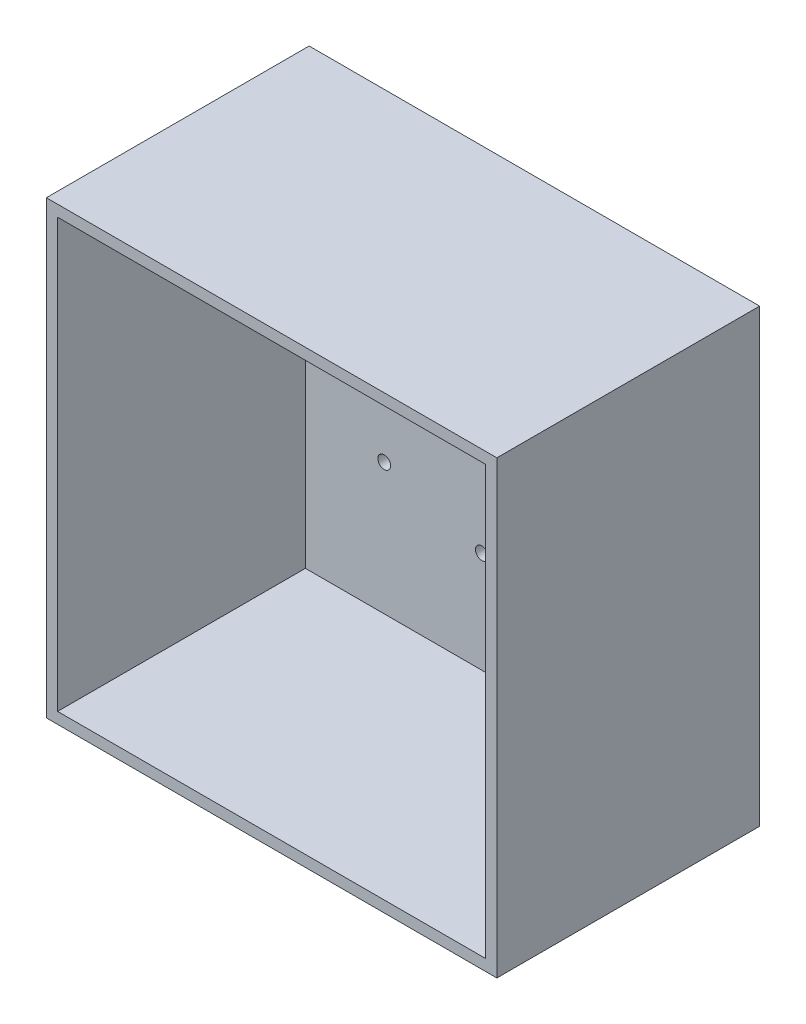
ISO-10303-21;
HEADER;
FILE_DESCRIPTION(('STEP AP214'),'2;1');
FILE_NAME('part.step','',(''),(''),'','','');
FILE_SCHEMA(('AUTOMOTIVE_DESIGN { 1 0 10303 214 1 1 1 1 }'));
ENDSEC;
DATA;
#1=APPLICATION_CONTEXT('core data for automotive mechanical design processes');
#2=APPLICATION_PROTOCOL_DEFINITION('international standard','automotive_design',2000,#1);
#3=PRODUCT_CONTEXT('',#1,'mechanical');
#4=PRODUCT('Part','Part','',(#3));
#5=PRODUCT_RELATED_PRODUCT_CATEGORY('part','',(#4));
#6=PRODUCT_DEFINITION_FORMATION('','',#4);
#7=PRODUCT_DEFINITION_CONTEXT('part definition',#1,'design');
#8=PRODUCT_DEFINITION('design','',#6,#7);
#9=PRODUCT_DEFINITION_SHAPE('','',#8);
#10=(LENGTH_UNIT() NAMED_UNIT(*) SI_UNIT(.MILLI.,.METRE.));
#11=(NAMED_UNIT(*) PLANE_ANGLE_UNIT() SI_UNIT($,.RADIAN.));
#12=(NAMED_UNIT(*) SI_UNIT($,.STERADIAN.) SOLID_ANGLE_UNIT());
#13=UNCERTAINTY_MEASURE_WITH_UNIT(LENGTH_MEASURE(1.E-05),#10,'distance_accuracy_value','');
#14=(GEOMETRIC_REPRESENTATION_CONTEXT(3) GLOBAL_UNCERTAINTY_ASSIGNED_CONTEXT((#13)) GLOBAL_UNIT_ASSIGNED_CONTEXT((#10,
#11,#12)) REPRESENTATION_CONTEXT('',''));
#15=CARTESIAN_POINT('',(0.,0.,0.));
#16=DIRECTION('',(0.,0.,1.));
#17=DIRECTION('',(1.,0.,0.));
#18=AXIS2_PLACEMENT_3D('',#15,#16,#17);
#19=CARTESIAN_POINT('',(-127.,-57.,185.5));
#20=DIRECTION('',(0.,0.,1.));
#21=DIRECTION('',(1.,0.,0.));
#22=AXIS2_PLACEMENT_3D('',#19,#20,#21);
#23=PLANE('',#22);
#24=CARTESIAN_POINT('',(-80.,30.,185.5));
#25=DIRECTION('',(0.,0.,1.));
#26=DIRECTION('',(1.,0.,0.));
#27=AXIS2_PLACEMENT_3D('',#24,#25,#26);
#28=CIRCLE('',#27,1.7);
#29=CARTESIAN_POINT('',(-78.3,30.,185.5));
#30=VERTEX_POINT('',#29);
#31=EDGE_CURVE('E9',#30,#30,#28,.T.);
#32=ORIENTED_EDGE('',*,*,#31,.F.);
#33=EDGE_LOOP('',(#32));
#34=FACE_BOUND('',#33,.T.);
#35=CARTESIAN_POINT('',(-106.,22.,185.5));
#36=DIRECTION('',(0.,0.,1.));
#37=DIRECTION('',(1.,0.,0.));
#38=AXIS2_PLACEMENT_3D('',#35,#36,#37);
#39=CIRCLE('',#38,1.7);
#40=CARTESIAN_POINT('',(-104.3,22.,185.5));
#41=VERTEX_POINT('',#40);
#42=EDGE_CURVE('E209',#41,#41,#39,.T.);
#43=ORIENTED_EDGE('',*,*,#42,.F.);
#44=EDGE_LOOP('',(#43));
#45=FACE_BOUND('',#44,.T.);
#46=CARTESIAN_POINT('',(-80.,-30.,185.5));
#47=DIRECTION('',(0.,0.,1.));
#48=DIRECTION('',(1.,0.,0.));
#49=AXIS2_PLACEMENT_3D('',#46,#47,#48);
#50=CIRCLE('',#49,1.7);
#51=CARTESIAN_POINT('',(-78.3,-30.,185.5));
#52=VERTEX_POINT('',#51);
#53=EDGE_CURVE('E223',#52,#52,#50,.T.);
#54=ORIENTED_EDGE('',*,*,#53,.F.);
#55=EDGE_LOOP('',(#54));
#56=FACE_BOUND('',#55,.T.);
#57=CARTESIAN_POINT('',(-106.,-22.,185.5));
#58=DIRECTION('',(0.,0.,1.));
#59=DIRECTION('',(1.,0.,0.));
#60=AXIS2_PLACEMENT_3D('',#57,#58,#59);
#61=CIRCLE('',#60,1.7);
#62=CARTESIAN_POINT('',(-104.3,-22.,185.5));
#63=VERTEX_POINT('',#62);
#64=EDGE_CURVE('E195',#63,#63,#61,.T.);
#65=ORIENTED_EDGE('',*,*,#64,.F.);
#66=EDGE_LOOP('',(#65));
#67=FACE_BOUND('',#66,.T.);
#68=DIRECTION('',(0.,1.,0.));
#69=VECTOR('',#68,1.);
#70=CARTESIAN_POINT('',(-127.,-57.,185.5));
#71=LINE('',#70,#69);
#72=CARTESIAN_POINT('',(-127.,-57.,185.5));
#73=VERTEX_POINT('',#72);
#74=CARTESIAN_POINT('',(-127.,57.,185.5));
#75=VERTEX_POINT('',#74);
#76=EDGE_CURVE('E181',#73,#75,#71,.T.);
#77=ORIENTED_EDGE('',*,*,#76,.F.);
#78=DIRECTION('',(1.,0.,0.));
#79=VECTOR('',#78,1.);
#80=CARTESIAN_POINT('',(-127.,-57.,185.5));
#81=LINE('',#80,#79);
#82=CARTESIAN_POINT('',(-13.,-57.,185.5));
#83=VERTEX_POINT('',#82);
#84=EDGE_CURVE('E136',#73,#83,#81,.T.);
#85=ORIENTED_EDGE('',*,*,#84,.T.);
#86=DIRECTION('',(0.,1.,0.));
#87=VECTOR('',#86,1.);
#88=CARTESIAN_POINT('',(-13.,-57.,185.5));
#89=LINE('',#88,#87);
#90=CARTESIAN_POINT('',(-13.,57.,185.5));
#91=VERTEX_POINT('',#90);
#92=EDGE_CURVE('E251',#83,#91,#89,.T.);
#93=ORIENTED_EDGE('',*,*,#92,.T.);
#94=DIRECTION('',(1.,0.,0.));
#95=VECTOR('',#94,1.);
#96=CARTESIAN_POINT('',(-127.,57.,185.5));
#97=LINE('',#96,#95);
#98=EDGE_CURVE('E178',#75,#91,#97,.T.);
#99=ORIENTED_EDGE('',*,*,#98,.F.);
#100=EDGE_LOOP('',(#77,#85,#93,#99));
#101=FACE_BOUND('',#100,.T.);
#102=ADVANCED_FACE('F14',(#34,#45,#56,#67,#101),#23,.T.);
#103=CARTESIAN_POINT('',(-80.,30.,181.49));
#104=DIRECTION('',(0.,0.,1.));
#105=DIRECTION('',(1.,0.,0.));
#106=AXIS2_PLACEMENT_3D('',#103,#104,#105);
#107=CYLINDRICAL_SURFACE('',#106,1.7);
#108=DIRECTION('',(0.,0.,1.));
#109=VECTOR('',#108,1.);
#110=CARTESIAN_POINT('',(-78.3,30.,181.49));
#111=LINE('',#110,#109);
#112=CARTESIAN_POINT('',(-78.3,30.,181.5));
#113=VERTEX_POINT('',#112);
#114=EDGE_CURVE('E25',#113,#30,#111,.T.);
#115=ORIENTED_EDGE('',*,*,#114,.F.);
#116=CARTESIAN_POINT('',(-80.,30.,181.5));
#117=DIRECTION('',(0.,0.,1.));
#118=DIRECTION('',(1.,0.,0.));
#119=AXIS2_PLACEMENT_3D('',#116,#117,#118);
#120=CIRCLE('',#119,1.7);
#121=EDGE_CURVE('E202',#113,#113,#120,.T.);
#122=ORIENTED_EDGE('',*,*,#121,.F.);
#123=ORIENTED_EDGE('',*,*,#114,.T.);
#124=ORIENTED_EDGE('',*,*,#31,.T.);
#125=EDGE_LOOP('',(#115,#122,#123,#124));
#126=FACE_BOUND('',#125,.T.);
#127=ADVANCED_FACE('F16',(#126),#107,.F.);
#128=CARTESIAN_POINT('',(-106.,22.,181.49));
#129=DIRECTION('',(0.,0.,1.));
#130=DIRECTION('',(1.,0.,0.));
#131=AXIS2_PLACEMENT_3D('',#128,#129,#130);
#132=CYLINDRICAL_SURFACE('',#131,1.7);
#133=DIRECTION('',(0.,0.,1.));
#134=VECTOR('',#133,1.);
#135=CARTESIAN_POINT('',(-104.3,22.,181.49));
#136=LINE('',#135,#134);
#137=CARTESIAN_POINT('',(-104.3,22.,181.5));
#138=VERTEX_POINT('',#137);
#139=EDGE_CURVE('E212',#138,#41,#136,.T.);
#140=ORIENTED_EDGE('',*,*,#139,.F.);
#141=CARTESIAN_POINT('',(-106.,22.,181.5));
#142=DIRECTION('',(0.,0.,1.));
#143=DIRECTION('',(1.,0.,0.));
#144=AXIS2_PLACEMENT_3D('',#141,#142,#143);
#145=CIRCLE('',#144,1.7);
#146=EDGE_CURVE('E206',#138,#138,#145,.T.);
#147=ORIENTED_EDGE('',*,*,#146,.F.);
#148=ORIENTED_EDGE('',*,*,#139,.T.);
#149=ORIENTED_EDGE('',*,*,#42,.T.);
#150=EDGE_LOOP('',(#140,#147,#148,#149));
#151=FACE_BOUND('',#150,.T.);
#152=ADVANCED_FACE('F278',(#151),#132,.F.);
#153=CARTESIAN_POINT('',(-80.,-30.,181.49));
#154=DIRECTION('',(0.,0.,1.));
#155=DIRECTION('',(1.,0.,0.));
#156=AXIS2_PLACEMENT_3D('',#153,#154,#155);
#157=CYLINDRICAL_SURFACE('',#156,1.7);
#158=DIRECTION('',(0.,0.,1.));
#159=VECTOR('',#158,1.);
#160=CARTESIAN_POINT('',(-78.3,-30.,181.49));
#161=LINE('',#160,#159);
#162=CARTESIAN_POINT('',(-78.3,-30.,181.5));
#163=VERTEX_POINT('',#162);
#164=EDGE_CURVE('E198',#163,#52,#161,.T.);
#165=ORIENTED_EDGE('',*,*,#164,.F.);
#166=CARTESIAN_POINT('',(-80.,-30.,181.5));
#167=DIRECTION('',(0.,0.,1.));
#168=DIRECTION('',(1.,0.,0.));
#169=AXIS2_PLACEMENT_3D('',#166,#167,#168);
#170=CIRCLE('',#169,1.7);
#171=EDGE_CURVE('E18',#163,#163,#170,.T.);
#172=ORIENTED_EDGE('',*,*,#171,.F.);
#173=ORIENTED_EDGE('',*,*,#164,.T.);
#174=ORIENTED_EDGE('',*,*,#53,.T.);
#175=EDGE_LOOP('',(#165,#172,#173,#174));
#176=FACE_BOUND('',#175,.T.);
#177=ADVANCED_FACE('F275',(#176),#157,.F.);
#178=CARTESIAN_POINT('',(-106.,-22.,181.49));
#179=DIRECTION('',(0.,0.,1.));
#180=DIRECTION('',(1.,0.,0.));
#181=AXIS2_PLACEMENT_3D('',#178,#179,#180);
#182=CYLINDRICAL_SURFACE('',#181,1.7);
#183=DIRECTION('',(0.,0.,1.));
#184=VECTOR('',#183,1.);
#185=CARTESIAN_POINT('',(-104.3,-22.,181.49));
#186=LINE('',#185,#184);
#187=CARTESIAN_POINT('',(-104.3,-22.,181.5));
#188=VERTEX_POINT('',#187);
#189=EDGE_CURVE('E191',#188,#63,#186,.T.);
#190=ORIENTED_EDGE('',*,*,#189,.F.);
#191=CARTESIAN_POINT('',(-106.,-22.,181.5));
#192=DIRECTION('',(0.,0.,1.));
#193=DIRECTION('',(1.,0.,0.));
#194=AXIS2_PLACEMENT_3D('',#191,#192,#193);
#195=CIRCLE('',#194,1.7);
#196=EDGE_CURVE('E173',#188,#188,#195,.T.);
#197=ORIENTED_EDGE('',*,*,#196,.F.);
#198=ORIENTED_EDGE('',*,*,#189,.T.);
#199=ORIENTED_EDGE('',*,*,#64,.T.);
#200=EDGE_LOOP('',(#190,#197,#198,#199));
#201=FACE_BOUND('',#200,.T.);
#202=ADVANCED_FACE('F277',(#201),#182,.F.);
#203=CARTESIAN_POINT('',(-127.,-57.,185.5));
#204=DIRECTION('',(1.,0.,0.));
#205=DIRECTION('',(0.,1.,0.));
#206=AXIS2_PLACEMENT_3D('',#203,#204,#205);
#207=PLANE('',#206);
#208=DIRECTION('',(0.,0.,1.));
#209=VECTOR('',#208,1.);
#210=CARTESIAN_POINT('',(-127.,-57.,185.5));
#211=LINE('',#210,#209);
#212=CARTESIAN_POINT('',(-127.,-57.,251.5));
#213=VERTEX_POINT('',#212);
#214=EDGE_CURVE('E130',#73,#213,#211,.T.);
#215=ORIENTED_EDGE('',*,*,#214,.F.);
#216=ORIENTED_EDGE('',*,*,#76,.T.);
#217=DIRECTION('',(0.,0.,1.));
#218=VECTOR('',#217,1.);
#219=CARTESIAN_POINT('',(-127.,57.,185.5));
#220=LINE('',#219,#218);
#221=CARTESIAN_POINT('',(-127.,57.,251.5));
#222=VERTEX_POINT('',#221);
#223=EDGE_CURVE('E145',#75,#222,#220,.T.);
#224=ORIENTED_EDGE('',*,*,#223,.T.);
#225=DIRECTION('',(0.,1.,0.));
#226=VECTOR('',#225,1.);
#227=CARTESIAN_POINT('',(-127.,-58.5,251.5));
#228=LINE('',#227,#226);
#229=EDGE_CURVE('E142',#213,#222,#228,.T.);
#230=ORIENTED_EDGE('',*,*,#229,.F.);
#231=EDGE_LOOP('',(#215,#216,#224,#230));
#232=FACE_BOUND('',#231,.T.);
#233=ADVANCED_FACE('F143',(#232),#207,.T.);
#234=CARTESIAN_POINT('',(-127.,57.,185.5));
#235=DIRECTION('',(0.,1.,0.));
#236=DIRECTION('',(1.,0.,0.));
#237=AXIS2_PLACEMENT_3D('',#234,#235,#236);
#238=PLANE('',#237);
#239=DIRECTION('',(-1.,0.,0.));
#240=VECTOR('',#239,1.);
#241=CARTESIAN_POINT('',(-128.5,57.,251.5));
#242=LINE('',#241,#240);
#243=CARTESIAN_POINT('',(-13.,57.,251.5));
#244=VERTEX_POINT('',#243);
#245=EDGE_CURVE('E150',#244,#222,#242,.T.);
#246=ORIENTED_EDGE('',*,*,#245,.T.);
#247=ORIENTED_EDGE('',*,*,#223,.F.);
#248=ORIENTED_EDGE('',*,*,#98,.T.);
#249=DIRECTION('',(0.,0.,1.));
#250=VECTOR('',#249,1.);
#251=CARTESIAN_POINT('',(-13.,57.,185.5));
#252=LINE('',#251,#250);
#253=EDGE_CURVE('E139',#91,#244,#252,.T.);
#254=ORIENTED_EDGE('',*,*,#253,.T.);
#255=EDGE_LOOP('',(#246,#247,#248,#254));
#256=FACE_BOUND('',#255,.T.);
#257=ADVANCED_FACE('F298',(#256),#238,.F.);
#258=CARTESIAN_POINT('',(-13.,-57.,185.5));
#259=DIRECTION('',(1.,0.,0.));
#260=DIRECTION('',(0.,1.,0.));
#261=AXIS2_PLACEMENT_3D('',#258,#259,#260);
#262=PLANE('',#261);
#263=DIRECTION('',(0.,1.,0.));
#264=VECTOR('',#263,1.);
#265=CARTESIAN_POINT('',(-13.,-58.5,251.5));
#266=LINE('',#265,#264);
#267=CARTESIAN_POINT('',(-13.,-57.,251.5));
#268=VERTEX_POINT('',#267);
#269=EDGE_CURVE('E154',#268,#244,#266,.T.);
#270=ORIENTED_EDGE('',*,*,#269,.T.);
#271=ORIENTED_EDGE('',*,*,#253,.F.);
#272=ORIENTED_EDGE('',*,*,#92,.F.);
#273=DIRECTION('',(0.,0.,1.));
#274=VECTOR('',#273,1.);
#275=CARTESIAN_POINT('',(-13.,-57.,185.5));
#276=LINE('',#275,#274);
#277=EDGE_CURVE('E121',#83,#268,#276,.T.);
#278=ORIENTED_EDGE('',*,*,#277,.T.);
#279=EDGE_LOOP('',(#270,#271,#272,#278));
#280=FACE_BOUND('',#279,.T.);
#281=ADVANCED_FACE('F299',(#280),#262,.F.);
#282=CARTESIAN_POINT('',(-127.,-57.,185.5));
#283=DIRECTION('',(0.,1.,0.));
#284=DIRECTION('',(1.,0.,0.));
#285=AXIS2_PLACEMENT_3D('',#282,#283,#284);
#286=PLANE('',#285);
#287=ORIENTED_EDGE('',*,*,#277,.F.);
#288=ORIENTED_EDGE('',*,*,#84,.F.);
#289=ORIENTED_EDGE('',*,*,#214,.T.);
#290=DIRECTION('',(-1.,0.,0.));
#291=VECTOR('',#290,1.);
#292=CARTESIAN_POINT('',(-128.5,-57.,251.5));
#293=LINE('',#292,#291);
#294=EDGE_CURVE('E134',#268,#213,#293,.T.);
#295=ORIENTED_EDGE('',*,*,#294,.F.);
#296=EDGE_LOOP('',(#287,#288,#289,#295));
#297=FACE_BOUND('',#296,.T.);
#298=ADVANCED_FACE('F132',(#297),#286,.T.);
#299=CARTESIAN_POINT('',(-10.,-60.,181.5));
#300=DIRECTION('',(1.,0.,0.));
#301=DIRECTION('',(0.,1.,0.));
#302=AXIS2_PLACEMENT_3D('',#299,#300,#301);
#303=PLANE('',#302);
#304=DIRECTION('',(0.,0.,1.));
#305=VECTOR('',#304,1.);
#306=CARTESIAN_POINT('',(-10.,-60.,181.5));
#307=LINE('',#306,#305);
#308=CARTESIAN_POINT('',(-10.,-60.,181.5));
#309=VERTEX_POINT('',#308);
#310=CARTESIAN_POINT('',(-10.,-60.,251.5));
#311=VERTEX_POINT('',#310);
#312=EDGE_CURVE('E168',#309,#311,#307,.T.);
#313=ORIENTED_EDGE('',*,*,#312,.F.);
#314=DIRECTION('',(0.,1.,0.));
#315=VECTOR('',#314,1.);
#316=CARTESIAN_POINT('',(-10.,-60.,181.5));
#317=LINE('',#316,#315);
#318=CARTESIAN_POINT('',(-10.,60.,181.5));
#319=VERTEX_POINT('',#318);
#320=EDGE_CURVE('E177',#309,#319,#317,.T.);
#321=ORIENTED_EDGE('',*,*,#320,.T.);
#322=DIRECTION('',(0.,0.,1.));
#323=VECTOR('',#322,1.);
#324=CARTESIAN_POINT('',(-10.,60.,181.5));
#325=LINE('',#324,#323);
#326=CARTESIAN_POINT('',(-10.,60.,251.5));
#327=VERTEX_POINT('',#326);
#328=EDGE_CURVE('E219',#319,#327,#325,.T.);
#329=ORIENTED_EDGE('',*,*,#328,.T.);
#330=DIRECTION('',(0.,1.,0.));
#331=VECTOR('',#330,1.);
#332=CARTESIAN_POINT('',(-10.,-60.,251.5));
#333=LINE('',#332,#331);
#334=EDGE_CURVE('E163',#311,#327,#333,.T.);
#335=ORIENTED_EDGE('',*,*,#334,.F.);
#336=EDGE_LOOP('',(#313,#321,#329,#335));
#337=FACE_BOUND('',#336,.T.);
#338=ADVANCED_FACE('F305',(#337),#303,.T.);
#339=CARTESIAN_POINT('',(-130.,-60.,181.5));
#340=DIRECTION('',(0.,0.,1.));
#341=DIRECTION('',(1.,0.,0.));
#342=AXIS2_PLACEMENT_3D('',#339,#340,#341);
#343=PLANE('',#342);
#344=ORIENTED_EDGE('',*,*,#121,.T.);
#345=EDGE_LOOP('',(#344));
#346=FACE_BOUND('',#345,.T.);
#347=ORIENTED_EDGE('',*,*,#146,.T.);
#348=EDGE_LOOP('',(#347));
#349=FACE_BOUND('',#348,.T.);
#350=ORIENTED_EDGE('',*,*,#171,.T.);
#351=EDGE_LOOP('',(#350));
#352=FACE_BOUND('',#351,.T.);
#353=ORIENTED_EDGE('',*,*,#196,.T.);
#354=EDGE_LOOP('',(#353));
#355=FACE_BOUND('',#354,.T.);
#356=DIRECTION('',(1.,0.,0.));
#357=VECTOR('',#356,1.);
#358=CARTESIAN_POINT('',(-130.,60.,181.5));
#359=LINE('',#358,#357);
#360=CARTESIAN_POINT('',(-130.,60.,181.5));
#361=VERTEX_POINT('',#360);
#362=EDGE_CURVE('E215',#361,#319,#359,.T.);
#363=ORIENTED_EDGE('',*,*,#362,.T.);
#364=ORIENTED_EDGE('',*,*,#320,.F.);
#365=DIRECTION('',(1.,0.,0.));
#366=VECTOR('',#365,1.);
#367=CARTESIAN_POINT('',(-130.,-60.,181.5));
#368=LINE('',#367,#366);
#369=CARTESIAN_POINT('',(-130.,-60.,181.5));
#370=VERTEX_POINT('',#369);
#371=EDGE_CURVE('E247',#370,#309,#368,.T.);
#372=ORIENTED_EDGE('',*,*,#371,.F.);
#373=DIRECTION('',(0.,1.,0.));
#374=VECTOR('',#373,1.);
#375=CARTESIAN_POINT('',(-130.,-60.,181.5));
#376=LINE('',#375,#374);
#377=EDGE_CURVE('E190',#370,#361,#376,.T.);
#378=ORIENTED_EDGE('',*,*,#377,.T.);
#379=EDGE_LOOP('',(#363,#364,#372,#378));
#380=FACE_BOUND('',#379,.T.);
#381=ADVANCED_FACE('F271',(#346,#349,#352,#355,#380),#343,.F.);
#382=CARTESIAN_POINT('',(-130.,60.,181.5));
#383=DIRECTION('',(0.,1.,0.));
#384=DIRECTION('',(1.,0.,0.));
#385=AXIS2_PLACEMENT_3D('',#382,#383,#384);
#386=PLANE('',#385);
#387=ORIENTED_EDGE('',*,*,#362,.F.);
#388=DIRECTION('',(0.,0.,1.));
#389=VECTOR('',#388,1.);
#390=CARTESIAN_POINT('',(-130.,60.,181.5));
#391=LINE('',#390,#389);
#392=CARTESIAN_POINT('',(-130.,60.,251.5));
#393=VERTEX_POINT('',#392);
#394=EDGE_CURVE('E186',#361,#393,#391,.T.);
#395=ORIENTED_EDGE('',*,*,#394,.T.);
#396=DIRECTION('',(1.,0.,0.));
#397=VECTOR('',#396,1.);
#398=CARTESIAN_POINT('',(-130.,60.,251.5));
#399=LINE('',#398,#397);
#400=EDGE_CURVE('E156',#393,#327,#399,.T.);
#401=ORIENTED_EDGE('',*,*,#400,.T.);
#402=ORIENTED_EDGE('',*,*,#328,.F.);
#403=EDGE_LOOP('',(#387,#395,#401,#402));
#404=FACE_BOUND('',#403,.T.);
#405=ADVANCED_FACE('F324',(#404),#386,.T.);
#406=CARTESIAN_POINT('',(-130.,-60.,251.5));
#407=DIRECTION('',(0.,0.,1.));
#408=DIRECTION('',(1.,0.,0.));
#409=AXIS2_PLACEMENT_3D('',#406,#407,#408);
#410=PLANE('',#409);
#411=ORIENTED_EDGE('',*,*,#294,.T.);
#412=ORIENTED_EDGE('',*,*,#229,.T.);
#413=ORIENTED_EDGE('',*,*,#245,.F.);
#414=ORIENTED_EDGE('',*,*,#269,.F.);
#415=EDGE_LOOP('',(#411,#412,#413,#414));
#416=FACE_BOUND('',#415,.T.);
#417=DIRECTION('',(0.,1.,0.));
#418=VECTOR('',#417,1.);
#419=CARTESIAN_POINT('',(-130.,-60.,251.5));
#420=LINE('',#419,#418);
#421=CARTESIAN_POINT('',(-130.,-60.,251.5));
#422=VERTEX_POINT('',#421);
#423=EDGE_CURVE('E182',#422,#393,#420,.T.);
#424=ORIENTED_EDGE('',*,*,#423,.F.);
#425=DIRECTION('',(1.,0.,0.));
#426=VECTOR('',#425,1.);
#427=CARTESIAN_POINT('',(-130.,-60.,251.5));
#428=LINE('',#427,#426);
#429=EDGE_CURVE('E170',#422,#311,#428,.T.);
#430=ORIENTED_EDGE('',*,*,#429,.T.);
#431=ORIENTED_EDGE('',*,*,#334,.T.);
#432=ORIENTED_EDGE('',*,*,#400,.F.);
#433=EDGE_LOOP('',(#424,#430,#431,#432));
#434=FACE_BOUND('',#433,.T.);
#435=ADVANCED_FACE('F152',(#416,#434),#410,.T.);
#436=CARTESIAN_POINT('',(-130.,-60.,181.5));
#437=DIRECTION('',(0.,1.,0.));
#438=DIRECTION('',(1.,0.,0.));
#439=AXIS2_PLACEMENT_3D('',#436,#437,#438);
#440=PLANE('',#439);
#441=ORIENTED_EDGE('',*,*,#312,.T.);
#442=ORIENTED_EDGE('',*,*,#429,.F.);
#443=DIRECTION('',(0.,0.,1.));
#444=VECTOR('',#443,1.);
#445=CARTESIAN_POINT('',(-130.,-60.,181.5));
#446=LINE('',#445,#444);
#447=EDGE_CURVE('E171',#370,#422,#446,.T.);
#448=ORIENTED_EDGE('',*,*,#447,.F.);
#449=ORIENTED_EDGE('',*,*,#371,.T.);
#450=EDGE_LOOP('',(#441,#442,#448,#449));
#451=FACE_BOUND('',#450,.T.);
#452=ADVANCED_FACE('F332',(#451),#440,.F.);
#453=CARTESIAN_POINT('',(-130.,-60.,181.5));
#454=DIRECTION('',(1.,0.,0.));
#455=DIRECTION('',(0.,1.,0.));
#456=AXIS2_PLACEMENT_3D('',#453,#454,#455);
#457=PLANE('',#456);
#458=ORIENTED_EDGE('',*,*,#423,.T.);
#459=ORIENTED_EDGE('',*,*,#394,.F.);
#460=ORIENTED_EDGE('',*,*,#377,.F.);
#461=ORIENTED_EDGE('',*,*,#447,.T.);
#462=EDGE_LOOP('',(#458,#459,#460,#461));
#463=FACE_BOUND('',#462,.T.);
#464=ADVANCED_FACE('F329',(#463),#457,.F.);
#465=CLOSED_SHELL('',(#102,#127,#152,#177,#202,#233,#257,#281,#298,#338,#381,#405,#435,#452,#464));
#466=MANIFOLD_SOLID_BREP('B1',#465);
#467=ADVANCED_BREP_SHAPE_REPRESENTATION('',(#18,#466),#14);
#468=SHAPE_DEFINITION_REPRESENTATION(#9,#467);
ENDSEC;
END-ISO-10303-21;
